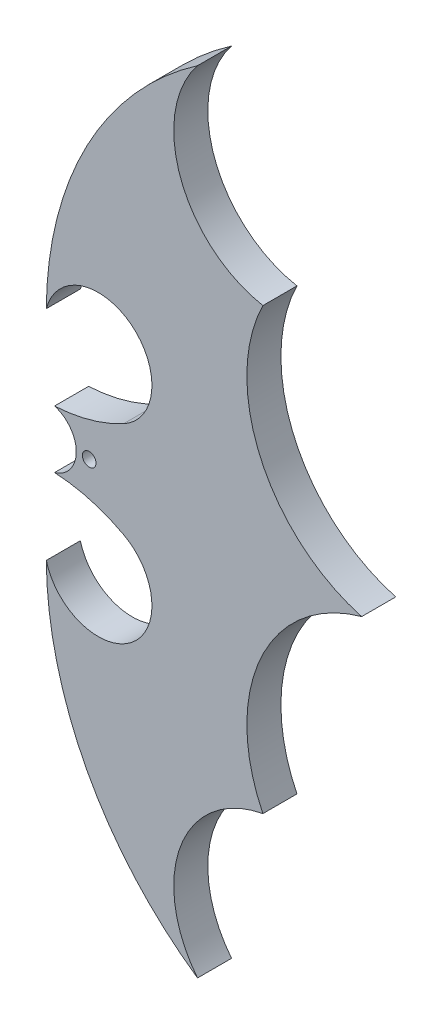
ISO-10303-21;
HEADER;
FILE_DESCRIPTION(('STEP AP214'),'2;1');
FILE_NAME('part.step','',(''),(''),'','','');
FILE_SCHEMA(('AUTOMOTIVE_DESIGN { 1 0 10303 214 1 1 1 1 }'));
ENDSEC;
DATA;
#1=APPLICATION_CONTEXT('core data for automotive mechanical design processes');
#2=APPLICATION_PROTOCOL_DEFINITION('international standard','automotive_design',2000,#1);
#3=PRODUCT_CONTEXT('',#1,'mechanical');
#4=PRODUCT('Part','Part','',(#3));
#5=PRODUCT_RELATED_PRODUCT_CATEGORY('part','',(#4));
#6=PRODUCT_DEFINITION_FORMATION('','',#4);
#7=PRODUCT_DEFINITION_CONTEXT('part definition',#1,'design');
#8=PRODUCT_DEFINITION('design','',#6,#7);
#9=PRODUCT_DEFINITION_SHAPE('','',#8);
#10=(LENGTH_UNIT() NAMED_UNIT(*) SI_UNIT(.MILLI.,.METRE.));
#11=(NAMED_UNIT(*) PLANE_ANGLE_UNIT() SI_UNIT($,.RADIAN.));
#12=(NAMED_UNIT(*) SI_UNIT($,.STERADIAN.) SOLID_ANGLE_UNIT());
#13=UNCERTAINTY_MEASURE_WITH_UNIT(LENGTH_MEASURE(1.E-05),#10,'distance_accuracy_value','');
#14=(GEOMETRIC_REPRESENTATION_CONTEXT(3) GLOBAL_UNCERTAINTY_ASSIGNED_CONTEXT((#13)) GLOBAL_UNIT_ASSIGNED_CONTEXT((#10,
#11,#12)) REPRESENTATION_CONTEXT('',''));
#15=CARTESIAN_POINT('',(0.,0.,0.));
#16=DIRECTION('',(0.,0.,1.));
#17=DIRECTION('',(1.,0.,0.));
#18=AXIS2_PLACEMENT_3D('',#15,#16,#17);
#19=CARTESIAN_POINT('',(6.14593123015279,-22.1636533386135,5.));
#20=DIRECTION('',(0.,0.,-1.));
#21=DIRECTION('',(-1.,0.,0.));
#22=AXIS2_PLACEMENT_3D('',#19,#20,#21);
#23=CYLINDRICAL_SURFACE('',#22,23.);
#24=CARTESIAN_POINT('',(6.14593123015279,-22.1636533386135,0.));
#25=DIRECTION('',(0.,0.,-1.));
#26=DIRECTION('',(1.,0.,0.));
#27=AXIS2_PLACEMENT_3D('',#24,#25,#26);
#28=CIRCLE('',#27,23.);
#29=CARTESIAN_POINT('',(-14.5,-32.3,0.));
#30=VERTEX_POINT('',#29);
#31=CARTESIAN_POINT('',(0.,0.,0.));
#32=VERTEX_POINT('',#31);
#33=EDGE_CURVE('E153',#30,#32,#28,.T.);
#34=ORIENTED_EDGE('',*,*,#33,.T.);
#35=DIRECTION('',(0.,0.,-1.));
#36=VECTOR('',#35,1.);
#37=CARTESIAN_POINT('',(0.,0.,5.));
#38=LINE('',#37,#36);
#39=CARTESIAN_POINT('',(0.,0.,5.));
#40=VERTEX_POINT('',#39);
#41=EDGE_CURVE('E11',#40,#32,#38,.T.);
#42=ORIENTED_EDGE('',*,*,#41,.F.);
#43=CARTESIAN_POINT('',(6.14593123015279,-22.1636533386135,5.));
#44=DIRECTION('',(0.,0.,-1.));
#45=DIRECTION('',(1.,0.,0.));
#46=AXIS2_PLACEMENT_3D('',#43,#44,#45);
#47=CIRCLE('',#46,23.);
#48=CARTESIAN_POINT('',(-14.5,-32.3,5.));
#49=VERTEX_POINT('',#48);
#50=EDGE_CURVE('E171',#49,#40,#47,.T.);
#51=ORIENTED_EDGE('',*,*,#50,.F.);
#52=DIRECTION('',(0.,0.,-1.));
#53=VECTOR('',#52,1.);
#54=CARTESIAN_POINT('',(-14.5,-32.3,5.));
#55=LINE('',#54,#53);
#56=EDGE_CURVE('E149',#49,#30,#55,.T.);
#57=ORIENTED_EDGE('',*,*,#56,.T.);
#58=EDGE_LOOP('',(#34,#42,#51,#57));
#59=FACE_BOUND('',#58,.T.);
#60=ADVANCED_FACE('F39',(#59),#23,.F.);
#61=CARTESIAN_POINT('',(6.14593123015279,22.1636533386135,5.));
#62=DIRECTION('',(0.,0.,-1.));
#63=DIRECTION('',(-1.,0.,0.));
#64=AXIS2_PLACEMENT_3D('',#61,#62,#63);
#65=CYLINDRICAL_SURFACE('',#64,23.);
#66=CARTESIAN_POINT('',(6.14593123015279,22.1636533386135,0.));
#67=DIRECTION('',(0.,0.,-1.));
#68=DIRECTION('',(-1.,0.,0.));
#69=AXIS2_PLACEMENT_3D('',#66,#67,#68);
#70=CIRCLE('',#69,23.);
#71=CARTESIAN_POINT('',(-14.5,32.3,0.));
#72=VERTEX_POINT('',#71);
#73=EDGE_CURVE('E156',#32,#72,#70,.T.);
#74=ORIENTED_EDGE('',*,*,#73,.T.);
#75=DIRECTION('',(0.,0.,-1.));
#76=VECTOR('',#75,1.);
#77=CARTESIAN_POINT('',(-14.5,32.3,5.));
#78=LINE('',#77,#76);
#79=CARTESIAN_POINT('',(-14.5,32.3,5.));
#80=VERTEX_POINT('',#79);
#81=EDGE_CURVE('E50',#80,#72,#78,.T.);
#82=ORIENTED_EDGE('',*,*,#81,.F.);
#83=CARTESIAN_POINT('',(6.14593123015279,22.1636533386135,5.));
#84=DIRECTION('',(0.,0.,-1.));
#85=DIRECTION('',(-1.,0.,0.));
#86=AXIS2_PLACEMENT_3D('',#83,#84,#85);
#87=CIRCLE('',#86,23.);
#88=EDGE_CURVE('E110',#40,#80,#87,.T.);
#89=ORIENTED_EDGE('',*,*,#88,.F.);
#90=ORIENTED_EDGE('',*,*,#41,.T.);
#91=EDGE_LOOP('',(#74,#82,#89,#90));
#92=FACE_BOUND('',#91,.T.);
#93=ADVANCED_FACE('F250',(#92),#65,.F.);
#94=CARTESIAN_POINT('',(-11.5843679641857,48.0321037954793,5.));
#95=DIRECTION('',(0.,0.,-1.));
#96=DIRECTION('',(-1.,0.,0.));
#97=AXIS2_PLACEMENT_3D('',#94,#95,#96);
#98=CYLINDRICAL_SURFACE('',#97,16.);
#99=CARTESIAN_POINT('',(-11.5843679641857,48.0321037954793,0.));
#100=DIRECTION('',(0.,0.,-1.));
#101=DIRECTION('',(-1.,0.,0.));
#102=AXIS2_PLACEMENT_3D('',#99,#100,#101);
#103=CIRCLE('',#102,16.);
#104=CARTESIAN_POINT('',(-24.1,58.,0.));
#105=VERTEX_POINT('',#104);
#106=EDGE_CURVE('E157',#72,#105,#103,.T.);
#107=ORIENTED_EDGE('',*,*,#106,.T.);
#108=DIRECTION('',(0.,0.,-1.));
#109=VECTOR('',#108,1.);
#110=CARTESIAN_POINT('',(-24.1,58.,5.));
#111=LINE('',#110,#109);
#112=CARTESIAN_POINT('',(-24.1,58.,5.));
#113=VERTEX_POINT('',#112);
#114=EDGE_CURVE('E188',#113,#105,#111,.T.);
#115=ORIENTED_EDGE('',*,*,#114,.F.);
#116=CARTESIAN_POINT('',(-11.5843679641857,48.0321037954793,5.));
#117=DIRECTION('',(0.,0.,-1.));
#118=DIRECTION('',(-1.,0.,0.));
#119=AXIS2_PLACEMENT_3D('',#116,#117,#118);
#120=CIRCLE('',#119,16.);
#121=EDGE_CURVE('E196',#80,#113,#120,.T.);
#122=ORIENTED_EDGE('',*,*,#121,.F.);
#123=ORIENTED_EDGE('',*,*,#81,.T.);
#124=EDGE_LOOP('',(#107,#115,#122,#123));
#125=FACE_BOUND('',#124,.T.);
#126=ADVANCED_FACE('F198',(#125),#98,.F.);
#127=CARTESIAN_POINT('',(5.19878577196076,15.6463560919636,5.));
#128=DIRECTION('',(0.,0.,-1.));
#129=DIRECTION('',(-1.,0.,0.));
#130=AXIS2_PLACEMENT_3D('',#127,#128,#129);
#131=CYLINDRICAL_SURFACE('',#130,51.5);
#132=CARTESIAN_POINT('',(5.19878577196076,15.6463560919636,0.));
#133=DIRECTION('',(0.,0.,1.));
#134=DIRECTION('',(1.,0.,0.));
#135=AXIS2_PLACEMENT_3D('',#132,#133,#134);
#136=CIRCLE('',#135,51.5);
#137=CARTESIAN_POINT('',(-46.3,16.,0.));
#138=VERTEX_POINT('',#137);
#139=EDGE_CURVE('E161',#105,#138,#136,.T.);
#140=ORIENTED_EDGE('',*,*,#139,.T.);
#141=DIRECTION('',(0.,0.,-1.));
#142=VECTOR('',#141,1.);
#143=CARTESIAN_POINT('',(-46.3,16.,5.));
#144=LINE('',#143,#142);
#145=CARTESIAN_POINT('',(-46.3,16.,5.));
#146=VERTEX_POINT('',#145);
#147=EDGE_CURVE('E190',#146,#138,#144,.T.);
#148=ORIENTED_EDGE('',*,*,#147,.F.);
#149=CARTESIAN_POINT('',(5.19878577196076,15.6463560919636,5.));
#150=DIRECTION('',(0.,0.,1.));
#151=DIRECTION('',(1.,0.,0.));
#152=AXIS2_PLACEMENT_3D('',#149,#150,#151);
#153=CIRCLE('',#152,51.5);
#154=EDGE_CURVE('E216',#113,#146,#153,.T.);
#155=ORIENTED_EDGE('',*,*,#154,.F.);
#156=ORIENTED_EDGE('',*,*,#114,.T.);
#157=EDGE_LOOP('',(#140,#148,#155,#156));
#158=FACE_BOUND('',#157,.T.);
#159=ADVANCED_FACE('F210',(#158),#131,.T.);
#160=CARTESIAN_POINT('',(-38.6754471442582,14.,5.));
#161=DIRECTION('',(0.,0.,-1.));
#162=DIRECTION('',(-1.,0.,0.));
#163=AXIS2_PLACEMENT_3D('',#160,#161,#162);
#164=CYLINDRICAL_SURFACE('',#163,7.8825);
#165=CARTESIAN_POINT('',(-38.6754471442582,14.,0.));
#166=DIRECTION('',(0.,0.,-1.));
#167=DIRECTION('',(-1.,0.,0.));
#168=AXIS2_PLACEMENT_3D('',#165,#166,#167);
#169=CIRCLE('',#168,7.8825);
#170=CARTESIAN_POINT('',(-34.9465476322133,7.0552815262913,0.));
#171=VERTEX_POINT('',#170);
#172=EDGE_CURVE('E162',#138,#171,#169,.T.);
#173=ORIENTED_EDGE('',*,*,#172,.T.);
#174=DIRECTION('',(0.,0.,-1.));
#175=VECTOR('',#174,1.);
#176=CARTESIAN_POINT('',(-34.9465476322133,7.0552815262913,5.));
#177=LINE('',#176,#175);
#178=CARTESIAN_POINT('',(-34.9465476322133,7.0552815262913,5.));
#179=VERTEX_POINT('',#178);
#180=EDGE_CURVE('E184',#179,#171,#177,.T.);
#181=ORIENTED_EDGE('',*,*,#180,.F.);
#182=CARTESIAN_POINT('',(-38.6754471442582,14.,5.));
#183=DIRECTION('',(0.,0.,-1.));
#184=DIRECTION('',(-1.,0.,0.));
#185=AXIS2_PLACEMENT_3D('',#182,#183,#184);
#186=CIRCLE('',#185,7.8825);
#187=EDGE_CURVE('E213',#146,#179,#186,.T.);
#188=ORIENTED_EDGE('',*,*,#187,.F.);
#189=ORIENTED_EDGE('',*,*,#147,.T.);
#190=EDGE_LOOP('',(#173,#181,#188,#189));
#191=FACE_BOUND('',#190,.T.);
#192=ADVANCED_FACE('F211',(#191),#164,.F.);
#193=CARTESIAN_POINT('',(-46.3,28.2,5.));
#194=DIRECTION('',(0.,0.,-1.));
#195=DIRECTION('',(-1.,0.,0.));
#196=AXIS2_PLACEMENT_3D('',#193,#194,#195);
#197=CYLINDRICAL_SURFACE('',#196,24.);
#198=CARTESIAN_POINT('',(-46.3,28.2,0.));
#199=DIRECTION('',(0.,0.,-1.));
#200=DIRECTION('',(-1.,0.,0.));
#201=AXIS2_PLACEMENT_3D('',#198,#199,#200);
#202=CIRCLE('',#201,24.);
#203=CARTESIAN_POINT('',(-45.090496071303,4.23049645390071,0.));
#204=VERTEX_POINT('',#203);
#205=EDGE_CURVE('E164',#171,#204,#202,.T.);
#206=ORIENTED_EDGE('',*,*,#205,.T.);
#207=DIRECTION('',(0.,0.,-1.));
#208=VECTOR('',#207,1.);
#209=CARTESIAN_POINT('',(-45.090496071303,4.23049645390071,5.));
#210=LINE('',#209,#208);
#211=CARTESIAN_POINT('',(-45.090496071303,4.23049645390071,5.));
#212=VERTEX_POINT('',#211);
#213=EDGE_CURVE('E182',#212,#204,#210,.T.);
#214=ORIENTED_EDGE('',*,*,#213,.F.);
#215=CARTESIAN_POINT('',(-46.3,28.2,5.));
#216=DIRECTION('',(0.,0.,-1.));
#217=DIRECTION('',(-1.,0.,0.));
#218=AXIS2_PLACEMENT_3D('',#215,#216,#217);
#219=CIRCLE('',#218,24.);
#220=EDGE_CURVE('E214',#179,#212,#219,.T.);
#221=ORIENTED_EDGE('',*,*,#220,.F.);
#222=ORIENTED_EDGE('',*,*,#180,.T.);
#223=EDGE_LOOP('',(#206,#214,#221,#222));
#224=FACE_BOUND('',#223,.T.);
#225=ADVANCED_FACE('F257',(#224),#197,.F.);
#226=CARTESIAN_POINT('',(-46.3,0.,5.));
#227=DIRECTION('',(0.,0.,-1.));
#228=DIRECTION('',(-1.,0.,0.));
#229=AXIS2_PLACEMENT_3D('',#226,#227,#228);
#230=CYLINDRICAL_SURFACE('',#229,4.4);
#231=CARTESIAN_POINT('',(-46.3,0.,0.));
#232=DIRECTION('',(0.,0.,-1.));
#233=DIRECTION('',(-1.,0.,0.));
#234=AXIS2_PLACEMENT_3D('',#231,#232,#233);
#235=CIRCLE('',#234,4.4);
#236=CARTESIAN_POINT('',(-45.090496071303,-4.23049645390071,0.));
#237=VERTEX_POINT('',#236);
#238=EDGE_CURVE('E170',#204,#237,#235,.T.);
#239=ORIENTED_EDGE('',*,*,#238,.T.);
#240=DIRECTION('',(0.,0.,-1.));
#241=VECTOR('',#240,1.);
#242=CARTESIAN_POINT('',(-45.090496071303,-4.23049645390071,5.));
#243=LINE('',#242,#241);
#244=CARTESIAN_POINT('',(-45.090496071303,-4.23049645390071,5.));
#245=VERTEX_POINT('',#244);
#246=EDGE_CURVE('E177',#245,#237,#243,.T.);
#247=ORIENTED_EDGE('',*,*,#246,.F.);
#248=CARTESIAN_POINT('',(-46.3,0.,5.));
#249=DIRECTION('',(0.,0.,-1.));
#250=DIRECTION('',(-1.,0.,0.));
#251=AXIS2_PLACEMENT_3D('',#248,#249,#250);
#252=CIRCLE('',#251,4.4);
#253=EDGE_CURVE('E217',#212,#245,#252,.T.);
#254=ORIENTED_EDGE('',*,*,#253,.F.);
#255=ORIENTED_EDGE('',*,*,#213,.T.);
#256=EDGE_LOOP('',(#239,#247,#254,#255));
#257=FACE_BOUND('',#256,.T.);
#258=ADVANCED_FACE('F230',(#257),#230,.F.);
#259=CARTESIAN_POINT('',(-46.3,-28.2,5.));
#260=DIRECTION('',(0.,0.,-1.));
#261=DIRECTION('',(-1.,0.,0.));
#262=AXIS2_PLACEMENT_3D('',#259,#260,#261);
#263=CYLINDRICAL_SURFACE('',#262,24.);
#264=CARTESIAN_POINT('',(-46.3,-28.2,0.));
#265=DIRECTION('',(0.,0.,-1.));
#266=DIRECTION('',(1.,0.,0.));
#267=AXIS2_PLACEMENT_3D('',#264,#265,#266);
#268=CIRCLE('',#267,24.);
#269=CARTESIAN_POINT('',(-34.9465476322133,-7.05528152629129,0.));
#270=VERTEX_POINT('',#269);
#271=EDGE_CURVE('E166',#237,#270,#268,.T.);
#272=ORIENTED_EDGE('',*,*,#271,.T.);
#273=DIRECTION('',(0.,0.,-1.));
#274=VECTOR('',#273,1.);
#275=CARTESIAN_POINT('',(-34.9465476322133,-7.05528152629129,5.));
#276=LINE('',#275,#274);
#277=CARTESIAN_POINT('',(-34.9465476322133,-7.05528152629129,5.));
#278=VERTEX_POINT('',#277);
#279=EDGE_CURVE('E145',#278,#270,#276,.T.);
#280=ORIENTED_EDGE('',*,*,#279,.F.);
#281=CARTESIAN_POINT('',(-46.3,-28.2,5.));
#282=DIRECTION('',(0.,0.,-1.));
#283=DIRECTION('',(1.,0.,0.));
#284=AXIS2_PLACEMENT_3D('',#281,#282,#283);
#285=CIRCLE('',#284,24.);
#286=EDGE_CURVE('E133',#245,#278,#285,.T.);
#287=ORIENTED_EDGE('',*,*,#286,.F.);
#288=ORIENTED_EDGE('',*,*,#246,.T.);
#289=EDGE_LOOP('',(#272,#280,#287,#288));
#290=FACE_BOUND('',#289,.T.);
#291=ADVANCED_FACE('F231',(#290),#263,.F.);
#292=CARTESIAN_POINT('',(-38.6754471442582,-14.,5.));
#293=DIRECTION('',(0.,0.,-1.));
#294=DIRECTION('',(-1.,0.,0.));
#295=AXIS2_PLACEMENT_3D('',#292,#293,#294);
#296=CYLINDRICAL_SURFACE('',#295,7.8825);
#297=CARTESIAN_POINT('',(-38.6754471442582,-14.,0.));
#298=DIRECTION('',(0.,0.,-1.));
#299=DIRECTION('',(1.,0.,0.));
#300=AXIS2_PLACEMENT_3D('',#297,#298,#299);
#301=CIRCLE('',#300,7.8825);
#302=CARTESIAN_POINT('',(-46.3,-16.,0.));
#303=VERTEX_POINT('',#302);
#304=EDGE_CURVE('E141',#270,#303,#301,.T.);
#305=ORIENTED_EDGE('',*,*,#304,.T.);
#306=DIRECTION('',(0.,0.,-1.));
#307=VECTOR('',#306,1.);
#308=CARTESIAN_POINT('',(-46.3,-16.,5.));
#309=LINE('',#308,#307);
#310=CARTESIAN_POINT('',(-46.3,-16.,5.));
#311=VERTEX_POINT('',#310);
#312=EDGE_CURVE('E139',#311,#303,#309,.T.);
#313=ORIENTED_EDGE('',*,*,#312,.F.);
#314=CARTESIAN_POINT('',(-38.6754471442582,-14.,5.));
#315=DIRECTION('',(0.,0.,-1.));
#316=DIRECTION('',(1.,0.,0.));
#317=AXIS2_PLACEMENT_3D('',#314,#315,#316);
#318=CIRCLE('',#317,7.8825);
#319=EDGE_CURVE('E129',#278,#311,#318,.T.);
#320=ORIENTED_EDGE('',*,*,#319,.F.);
#321=ORIENTED_EDGE('',*,*,#279,.T.);
#322=EDGE_LOOP('',(#305,#313,#320,#321));
#323=FACE_BOUND('',#322,.T.);
#324=ADVANCED_FACE('F143',(#323),#296,.F.);
#325=CARTESIAN_POINT('',(5.19878577196076,-15.6463560919636,5.));
#326=DIRECTION('',(0.,0.,-1.));
#327=DIRECTION('',(-1.,0.,0.));
#328=AXIS2_PLACEMENT_3D('',#325,#326,#327);
#329=CYLINDRICAL_SURFACE('',#328,51.5);
#330=CARTESIAN_POINT('',(5.19878577196076,-15.6463560919636,0.));
#331=DIRECTION('',(0.,0.,1.));
#332=DIRECTION('',(-1.,0.,0.));
#333=AXIS2_PLACEMENT_3D('',#330,#331,#332);
#334=CIRCLE('',#333,51.5);
#335=CARTESIAN_POINT('',(-24.1,-58.,0.));
#336=VERTEX_POINT('',#335);
#337=EDGE_CURVE('E91',#303,#336,#334,.T.);
#338=ORIENTED_EDGE('',*,*,#337,.T.);
#339=DIRECTION('',(0.,0.,-1.));
#340=VECTOR('',#339,1.);
#341=CARTESIAN_POINT('',(-24.1,-58.,5.));
#342=LINE('',#341,#340);
#343=CARTESIAN_POINT('',(-24.1,-58.,5.));
#344=VERTEX_POINT('',#343);
#345=EDGE_CURVE('E144',#344,#336,#342,.T.);
#346=ORIENTED_EDGE('',*,*,#345,.F.);
#347=CARTESIAN_POINT('',(5.19878577196076,-15.6463560919636,5.));
#348=DIRECTION('',(0.,0.,1.));
#349=DIRECTION('',(-1.,0.,0.));
#350=AXIS2_PLACEMENT_3D('',#347,#348,#349);
#351=CIRCLE('',#350,51.5);
#352=EDGE_CURVE('E134',#311,#344,#351,.T.);
#353=ORIENTED_EDGE('',*,*,#352,.F.);
#354=ORIENTED_EDGE('',*,*,#312,.T.);
#355=EDGE_LOOP('',(#338,#346,#353,#354));
#356=FACE_BOUND('',#355,.T.);
#357=ADVANCED_FACE('F150',(#356),#329,.T.);
#358=CARTESIAN_POINT('',(-11.5843679641857,-48.0321037954793,5.));
#359=DIRECTION('',(0.,0.,-1.));
#360=DIRECTION('',(-1.,0.,0.));
#361=AXIS2_PLACEMENT_3D('',#358,#359,#360);
#362=CYLINDRICAL_SURFACE('',#361,16.);
#363=CARTESIAN_POINT('',(-11.5843679641857,-48.0321037954793,0.));
#364=DIRECTION('',(0.,0.,-1.));
#365=DIRECTION('',(1.,0.,0.));
#366=AXIS2_PLACEMENT_3D('',#363,#364,#365);
#367=CIRCLE('',#366,16.);
#368=EDGE_CURVE('E97',#336,#30,#367,.T.);
#369=ORIENTED_EDGE('',*,*,#368,.T.);
#370=ORIENTED_EDGE('',*,*,#56,.F.);
#371=CARTESIAN_POINT('',(-11.5843679641857,-48.0321037954793,5.));
#372=DIRECTION('',(0.,0.,-1.));
#373=DIRECTION('',(1.,0.,0.));
#374=AXIS2_PLACEMENT_3D('',#371,#372,#373);
#375=CIRCLE('',#374,16.);
#376=EDGE_CURVE('E54',#344,#49,#375,.T.);
#377=ORIENTED_EDGE('',*,*,#376,.F.);
#378=ORIENTED_EDGE('',*,*,#345,.T.);
#379=EDGE_LOOP('',(#369,#370,#377,#378));
#380=FACE_BOUND('',#379,.T.);
#381=ADVANCED_FACE('F234',(#380),#362,.F.);
#382=CARTESIAN_POINT('',(-2.71921836701646,-35.0978785670464,5.));
#383=DIRECTION('',(0.,0.,1.));
#384=DIRECTION('',(1.,0.,0.));
#385=AXIS2_PLACEMENT_3D('',#382,#383,#384);
#386=PLANE('',#385);
#387=CARTESIAN_POINT('',(-40.,0.,5.));
#388=DIRECTION('',(0.,0.,1.));
#389=DIRECTION('',(1.,0.,0.));
#390=AXIS2_PLACEMENT_3D('',#387,#388,#389);
#391=CIRCLE('',#390,0.999999999999998);
#392=CARTESIAN_POINT('',(-39.,0.,5.));
#393=VERTEX_POINT('',#392);
#394=EDGE_CURVE('E312',#393,#393,#391,.T.);
#395=ORIENTED_EDGE('',*,*,#394,.F.);
#396=EDGE_LOOP('',(#395));
#397=FACE_BOUND('',#396,.T.);
#398=ORIENTED_EDGE('',*,*,#50,.T.);
#399=ORIENTED_EDGE('',*,*,#88,.T.);
#400=ORIENTED_EDGE('',*,*,#121,.T.);
#401=ORIENTED_EDGE('',*,*,#154,.T.);
#402=ORIENTED_EDGE('',*,*,#187,.T.);
#403=ORIENTED_EDGE('',*,*,#220,.T.);
#404=ORIENTED_EDGE('',*,*,#253,.T.);
#405=ORIENTED_EDGE('',*,*,#286,.T.);
#406=ORIENTED_EDGE('',*,*,#319,.T.);
#407=ORIENTED_EDGE('',*,*,#352,.T.);
#408=ORIENTED_EDGE('',*,*,#376,.T.);
#409=EDGE_LOOP('',(#398,#399,#400,#401,#402,#403,#404,#405,#406,#407,#408));
#410=FACE_BOUND('',#409,.T.);
#411=ADVANCED_FACE('F132',(#397,#410),#386,.T.);
#412=CARTESIAN_POINT('',(-2.71921836701646,-35.0978785670464,0.));
#413=DIRECTION('',(0.,0.,1.));
#414=DIRECTION('',(1.,0.,0.));
#415=AXIS2_PLACEMENT_3D('',#412,#413,#414);
#416=PLANE('',#415);
#417=CARTESIAN_POINT('',(-40.,0.,0.));
#418=DIRECTION('',(0.,0.,1.));
#419=DIRECTION('',(1.,0.,0.));
#420=AXIS2_PLACEMENT_3D('',#417,#418,#419);
#421=CIRCLE('',#420,0.999999999999998);
#422=CARTESIAN_POINT('',(-39.,0.,0.));
#423=VERTEX_POINT('',#422);
#424=EDGE_CURVE('E160',#423,#423,#421,.T.);
#425=ORIENTED_EDGE('',*,*,#424,.T.);
#426=EDGE_LOOP('',(#425));
#427=FACE_BOUND('',#426,.T.);
#428=ORIENTED_EDGE('',*,*,#33,.F.);
#429=ORIENTED_EDGE('',*,*,#368,.F.);
#430=ORIENTED_EDGE('',*,*,#337,.F.);
#431=ORIENTED_EDGE('',*,*,#304,.F.);
#432=ORIENTED_EDGE('',*,*,#271,.F.);
#433=ORIENTED_EDGE('',*,*,#238,.F.);
#434=ORIENTED_EDGE('',*,*,#205,.F.);
#435=ORIENTED_EDGE('',*,*,#172,.F.);
#436=ORIENTED_EDGE('',*,*,#139,.F.);
#437=ORIENTED_EDGE('',*,*,#106,.F.);
#438=ORIENTED_EDGE('',*,*,#73,.F.);
#439=EDGE_LOOP('',(#428,#429,#430,#431,#432,#433,#434,#435,#436,#437,#438));
#440=FACE_BOUND('',#439,.T.);
#441=ADVANCED_FACE('F205',(#427,#440),#416,.F.);
#442=CARTESIAN_POINT('',(-40.,0.,0.));
#443=DIRECTION('',(0.,0.,1.));
#444=DIRECTION('',(1.,0.,0.));
#445=AXIS2_PLACEMENT_3D('',#442,#443,#444);
#446=CYLINDRICAL_SURFACE('',#445,0.999999999999998);
#447=ORIENTED_EDGE('',*,*,#424,.F.);
#448=EDGE_LOOP('',(#447));
#449=FACE_BOUND('',#448,.T.);
#450=ORIENTED_EDGE('',*,*,#394,.T.);
#451=EDGE_LOOP('',(#450));
#452=FACE_BOUND('',#451,.T.);
#453=ADVANCED_FACE('F299',(#449,#452),#446,.F.);
#454=CLOSED_SHELL('',(#60,#93,#126,#159,#192,#225,#258,#291,#324,#357,#381,#411,#441,#453));
#455=MANIFOLD_SOLID_BREP('B2',#454);
#456=ADVANCED_BREP_SHAPE_REPRESENTATION('',(#18,#455),#14);
#457=SHAPE_DEFINITION_REPRESENTATION(#9,#456);
ENDSEC;
END-ISO-10303-21;
